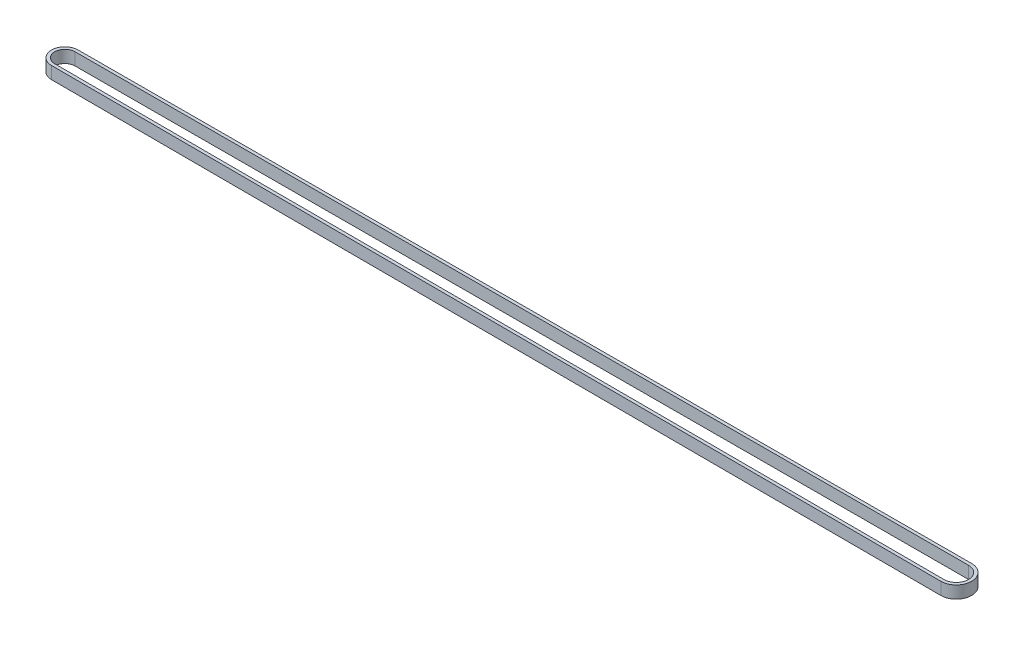
ISO-10303-21;
HEADER;
FILE_DESCRIPTION(('STEP AP214'),'2;1');
FILE_NAME('part.step','',(''),(''),'','','');
FILE_SCHEMA(('AUTOMOTIVE_DESIGN { 1 0 10303 214 1 1 1 1 }'));
ENDSEC;
DATA;
#1=APPLICATION_CONTEXT('core data for automotive mechanical design processes');
#2=APPLICATION_PROTOCOL_DEFINITION('international standard','automotive_design',2000,#1);
#3=PRODUCT_CONTEXT('',#1,'mechanical');
#4=PRODUCT('Part','Part','',(#3));
#5=PRODUCT_RELATED_PRODUCT_CATEGORY('part','',(#4));
#6=PRODUCT_DEFINITION_FORMATION('','',#4);
#7=PRODUCT_DEFINITION_CONTEXT('part definition',#1,'design');
#8=PRODUCT_DEFINITION('design','',#6,#7);
#9=PRODUCT_DEFINITION_SHAPE('','',#8);
#10=(LENGTH_UNIT() NAMED_UNIT(*) SI_UNIT(.MILLI.,.METRE.));
#11=(NAMED_UNIT(*) PLANE_ANGLE_UNIT() SI_UNIT($,.RADIAN.));
#12=(NAMED_UNIT(*) SI_UNIT($,.STERADIAN.) SOLID_ANGLE_UNIT());
#13=UNCERTAINTY_MEASURE_WITH_UNIT(LENGTH_MEASURE(1.E-05),#10,'distance_accuracy_value','');
#14=(GEOMETRIC_REPRESENTATION_CONTEXT(3) GLOBAL_UNCERTAINTY_ASSIGNED_CONTEXT((#13)) GLOBAL_UNIT_ASSIGNED_CONTEXT((#10,
#11,#12)) REPRESENTATION_CONTEXT('',''));
#15=CARTESIAN_POINT('',(0.,0.,0.));
#16=DIRECTION('',(0.,0.,1.));
#17=DIRECTION('',(1.,0.,0.));
#18=AXIS2_PLACEMENT_3D('',#15,#16,#17);
#19=CARTESIAN_POINT('',(-60.13,6.,0.));
#20=DIRECTION('',(0.,-1.,0.));
#21=DIRECTION('',(0.,0.,-1.));
#22=AXIS2_PLACEMENT_3D('',#19,#20,#21);
#23=PLANE('',#22);
#24=CARTESIAN_POINT('',(-60.13,6.,0.));
#25=DIRECTION('',(0.,1.,0.));
#26=DIRECTION('',(0.,0.,-1.));
#27=AXIS2_PLACEMENT_3D('',#24,#25,#26);
#28=CIRCLE('',#27,6.5);
#29=CARTESIAN_POINT('',(-60.1449873184229,6.,-6.49998272153753));
#30=VERTEX_POINT('',#29);
#31=CARTESIAN_POINT('',(-60.1449873184229,6.,6.49998272153754));
#32=VERTEX_POINT('',#31);
#33=EDGE_CURVE('E133',#30,#32,#28,.T.);
#34=ORIENTED_EDGE('',*,*,#33,.T.);
#35=DIRECTION('',(0.999997341775005,0.,0.00230574129582661));
#36=VECTOR('',#35,1.);
#37=CARTESIAN_POINT('',(-60.1449873184229,6.,6.49998272153754));
#38=LINE('',#37,#36);
#39=CARTESIAN_POINT('',(373.552706940281,6.,7.49998006331255));
#40=VERTEX_POINT('',#39);
#41=EDGE_CURVE('E136',#32,#40,#38,.T.);
#42=ORIENTED_EDGE('',*,*,#41,.T.);
#43=CARTESIAN_POINT('',(373.57,6.,0.));
#44=DIRECTION('',(0.,1.,0.));
#45=DIRECTION('',(0.,0.,-1.));
#46=AXIS2_PLACEMENT_3D('',#43,#44,#45);
#47=CIRCLE('',#46,7.5);
#48=CARTESIAN_POINT('',(373.552706940281,6.,-7.49998006331253));
#49=VERTEX_POINT('',#48);
#50=EDGE_CURVE('E139',#40,#49,#47,.T.);
#51=ORIENTED_EDGE('',*,*,#50,.T.);
#52=DIRECTION('',(-0.999997341775005,0.,0.00230574129582661));
#53=VECTOR('',#52,1.);
#54=CARTESIAN_POINT('',(-60.1449873184229,6.,-6.49998272153753));
#55=LINE('',#54,#53);
#56=EDGE_CURVE('E141',#49,#30,#55,.T.);
#57=ORIENTED_EDGE('',*,*,#56,.T.);
#58=EDGE_LOOP('',(#34,#42,#51,#57));
#59=FACE_BOUND('',#58,.T.);
#60=CARTESIAN_POINT('',(-60.13,6.,0.));
#61=DIRECTION('',(0.,1.,0.));
#62=DIRECTION('',(0.,0.,-1.));
#63=AXIS2_PLACEMENT_3D('',#60,#61,#62);
#64=CIRCLE('',#63,5.);
#65=CARTESIAN_POINT('',(-60.1415287064791,6.,-4.99998670887502));
#66=VERTEX_POINT('',#65);
#67=CARTESIAN_POINT('',(-60.1415287064791,6.,4.99998670887503));
#68=VERTEX_POINT('',#67);
#69=EDGE_CURVE('E97',#66,#68,#64,.T.);
#70=ORIENTED_EDGE('',*,*,#69,.F.);
#71=DIRECTION('',(-0.999997341775005,0.,0.00230574129582661));
#72=VECTOR('',#71,1.);
#73=CARTESIAN_POINT('',(-60.1415287064791,6.,-4.99998670887502));
#74=LINE('',#73,#72);
#75=CARTESIAN_POINT('',(373.556165552225,6.,-5.99998405065003));
#76=VERTEX_POINT('',#75);
#77=EDGE_CURVE('E119',#76,#66,#74,.T.);
#78=ORIENTED_EDGE('',*,*,#77,.F.);
#79=CARTESIAN_POINT('',(373.57,6.,0.));
#80=DIRECTION('',(0.,1.,0.));
#81=DIRECTION('',(0.,0.,-1.));
#82=AXIS2_PLACEMENT_3D('',#79,#80,#81);
#83=CIRCLE('',#82,6.);
#84=CARTESIAN_POINT('',(373.556165552225,6.,5.99998405065004));
#85=VERTEX_POINT('',#84);
#86=EDGE_CURVE('E117',#85,#76,#83,.T.);
#87=ORIENTED_EDGE('',*,*,#86,.F.);
#88=DIRECTION('',(0.999997341775005,0.,0.00230574129582661));
#89=VECTOR('',#88,1.);
#90=CARTESIAN_POINT('',(-60.1415287064791,6.,4.99998670887503));
#91=LINE('',#90,#89);
#92=EDGE_CURVE('E105',#68,#85,#91,.T.);
#93=ORIENTED_EDGE('',*,*,#92,.F.);
#94=EDGE_LOOP('',(#70,#78,#87,#93));
#95=FACE_BOUND('',#94,.T.);
#96=ADVANCED_FACE('F32',(#59,#95),#23,.F.);
#97=CARTESIAN_POINT('',(-60.13,0.,0.));
#98=DIRECTION('',(0.,-1.,0.));
#99=DIRECTION('',(0.,0.,-1.));
#100=AXIS2_PLACEMENT_3D('',#97,#98,#99);
#101=PLANE('',#100);
#102=CARTESIAN_POINT('',(-60.13,0.,0.));
#103=DIRECTION('',(0.,1.,0.));
#104=DIRECTION('',(0.,0.,-1.));
#105=AXIS2_PLACEMENT_3D('',#102,#103,#104);
#106=CIRCLE('',#105,6.5);
#107=CARTESIAN_POINT('',(-60.1449873184229,0.,-6.49998272153753));
#108=VERTEX_POINT('',#107);
#109=CARTESIAN_POINT('',(-60.1449873184229,0.,6.49998272153754));
#110=VERTEX_POINT('',#109);
#111=EDGE_CURVE('E113',#108,#110,#106,.T.);
#112=ORIENTED_EDGE('',*,*,#111,.F.);
#113=DIRECTION('',(-0.999997341775005,0.,0.00230574129582661));
#114=VECTOR('',#113,1.);
#115=CARTESIAN_POINT('',(-60.1449873184229,0.,-6.49998272153753));
#116=LINE('',#115,#114);
#117=CARTESIAN_POINT('',(373.552706940281,0.,-7.49998006331253));
#118=VERTEX_POINT('',#117);
#119=EDGE_CURVE('E137',#118,#108,#116,.T.);
#120=ORIENTED_EDGE('',*,*,#119,.F.);
#121=CARTESIAN_POINT('',(373.57,0.,0.));
#122=DIRECTION('',(0.,1.,0.));
#123=DIRECTION('',(0.,0.,-1.));
#124=AXIS2_PLACEMENT_3D('',#121,#122,#123);
#125=CIRCLE('',#124,7.5);
#126=CARTESIAN_POINT('',(373.552706940281,0.,7.49998006331255));
#127=VERTEX_POINT('',#126);
#128=EDGE_CURVE('E148',#127,#118,#125,.T.);
#129=ORIENTED_EDGE('',*,*,#128,.F.);
#130=DIRECTION('',(0.999997341775005,0.,0.00230574129582661));
#131=VECTOR('',#130,1.);
#132=CARTESIAN_POINT('',(-60.1449873184229,0.,6.49998272153754));
#133=LINE('',#132,#131);
#134=EDGE_CURVE('E146',#110,#127,#133,.T.);
#135=ORIENTED_EDGE('',*,*,#134,.F.);
#136=EDGE_LOOP('',(#112,#120,#129,#135));
#137=FACE_BOUND('',#136,.T.);
#138=DIRECTION('',(-0.999997341775005,0.,0.00230574129582661));
#139=VECTOR('',#138,1.);
#140=CARTESIAN_POINT('',(-60.1415287064791,0.,-4.99998670887502));
#141=LINE('',#140,#139);
#142=CARTESIAN_POINT('',(373.556165552225,0.,-5.99998405065003));
#143=VERTEX_POINT('',#142);
#144=CARTESIAN_POINT('',(-60.1415287064791,0.,-4.99998670887502));
#145=VERTEX_POINT('',#144);
#146=EDGE_CURVE('E106',#143,#145,#141,.T.);
#147=ORIENTED_EDGE('',*,*,#146,.T.);
#148=CARTESIAN_POINT('',(-60.13,0.,0.));
#149=DIRECTION('',(0.,1.,0.));
#150=DIRECTION('',(0.,0.,-1.));
#151=AXIS2_PLACEMENT_3D('',#148,#149,#150);
#152=CIRCLE('',#151,5.);
#153=CARTESIAN_POINT('',(-60.1415287064791,0.,4.99998670887503));
#154=VERTEX_POINT('',#153);
#155=EDGE_CURVE('E55',#145,#154,#152,.T.);
#156=ORIENTED_EDGE('',*,*,#155,.T.);
#157=DIRECTION('',(0.999997341775005,0.,0.00230574129582661));
#158=VECTOR('',#157,1.);
#159=CARTESIAN_POINT('',(-60.1415287064791,0.,4.99998670887503));
#160=LINE('',#159,#158);
#161=CARTESIAN_POINT('',(373.556165552225,0.,5.99998405065004));
#162=VERTEX_POINT('',#161);
#163=EDGE_CURVE('E112',#154,#162,#160,.T.);
#164=ORIENTED_EDGE('',*,*,#163,.T.);
#165=CARTESIAN_POINT('',(373.57,0.,0.));
#166=DIRECTION('',(0.,1.,0.));
#167=DIRECTION('',(0.,0.,-1.));
#168=AXIS2_PLACEMENT_3D('',#165,#166,#167);
#169=CIRCLE('',#168,6.);
#170=EDGE_CURVE('E125',#162,#143,#169,.T.);
#171=ORIENTED_EDGE('',*,*,#170,.T.);
#172=EDGE_LOOP('',(#147,#156,#164,#171));
#173=FACE_BOUND('',#172,.T.);
#174=ADVANCED_FACE('F166',(#137,#173),#101,.T.);
#175=CARTESIAN_POINT('',(-60.13,6.,0.));
#176=DIRECTION('',(0.,-1.,0.));
#177=DIRECTION('',(0.,0.,-1.));
#178=AXIS2_PLACEMENT_3D('',#175,#176,#177);
#179=CYLINDRICAL_SURFACE('',#178,6.5);
#180=ORIENTED_EDGE('',*,*,#111,.T.);
#181=DIRECTION('',(0.,-1.,0.));
#182=VECTOR('',#181,1.);
#183=CARTESIAN_POINT('',(-60.1449873184229,6.,6.49998272153754));
#184=LINE('',#183,#182);
#185=EDGE_CURVE('E11',#32,#110,#184,.T.);
#186=ORIENTED_EDGE('',*,*,#185,.F.);
#187=ORIENTED_EDGE('',*,*,#33,.F.);
#188=DIRECTION('',(0.,-1.,0.));
#189=VECTOR('',#188,1.);
#190=CARTESIAN_POINT('',(-60.1449873184229,6.,-6.49998272153753));
#191=LINE('',#190,#189);
#192=EDGE_CURVE('E143',#30,#108,#191,.T.);
#193=ORIENTED_EDGE('',*,*,#192,.T.);
#194=EDGE_LOOP('',(#180,#186,#187,#193));
#195=FACE_BOUND('',#194,.T.);
#196=ADVANCED_FACE('F34',(#195),#179,.T.);
#197=CARTESIAN_POINT('',(-60.1449873184229,6.,6.49998272153754));
#198=DIRECTION('',(0.00230574129582661,0.,-0.999997341775005));
#199=DIRECTION('',(-0.999997341775005,0.,-0.00230574129582661));
#200=AXIS2_PLACEMENT_3D('',#197,#198,#199);
#201=PLANE('',#200);
#202=ORIENTED_EDGE('',*,*,#134,.T.);
#203=DIRECTION('',(0.,-1.,0.));
#204=VECTOR('',#203,1.);
#205=CARTESIAN_POINT('',(373.552706940281,6.,7.49998006331255));
#206=LINE('',#205,#204);
#207=EDGE_CURVE('E40',#40,#127,#206,.T.);
#208=ORIENTED_EDGE('',*,*,#207,.F.);
#209=ORIENTED_EDGE('',*,*,#41,.F.);
#210=ORIENTED_EDGE('',*,*,#185,.T.);
#211=EDGE_LOOP('',(#202,#208,#209,#210));
#212=FACE_BOUND('',#211,.T.);
#213=ADVANCED_FACE('F176',(#212),#201,.F.);
#214=CARTESIAN_POINT('',(373.57,6.,0.));
#215=DIRECTION('',(0.,-1.,0.));
#216=DIRECTION('',(0.,0.,-1.));
#217=AXIS2_PLACEMENT_3D('',#214,#215,#216);
#218=CYLINDRICAL_SURFACE('',#217,7.5);
#219=ORIENTED_EDGE('',*,*,#128,.T.);
#220=DIRECTION('',(0.,-1.,0.));
#221=VECTOR('',#220,1.);
#222=CARTESIAN_POINT('',(373.552706940281,6.,-7.49998006331253));
#223=LINE('',#222,#221);
#224=EDGE_CURVE('E153',#49,#118,#223,.T.);
#225=ORIENTED_EDGE('',*,*,#224,.F.);
#226=ORIENTED_EDGE('',*,*,#50,.F.);
#227=ORIENTED_EDGE('',*,*,#207,.T.);
#228=EDGE_LOOP('',(#219,#225,#226,#227));
#229=FACE_BOUND('',#228,.T.);
#230=ADVANCED_FACE('F160',(#229),#218,.T.);
#231=CARTESIAN_POINT('',(-60.1449873184229,6.,-6.49998272153753));
#232=DIRECTION('',(0.00230574129582661,0.,0.999997341775005));
#233=DIRECTION('',(0.999997341775005,0.,-0.00230574129582661));
#234=AXIS2_PLACEMENT_3D('',#231,#232,#233);
#235=PLANE('',#234);
#236=ORIENTED_EDGE('',*,*,#119,.T.);
#237=ORIENTED_EDGE('',*,*,#192,.F.);
#238=ORIENTED_EDGE('',*,*,#56,.F.);
#239=ORIENTED_EDGE('',*,*,#224,.T.);
#240=EDGE_LOOP('',(#236,#237,#238,#239));
#241=FACE_BOUND('',#240,.T.);
#242=ADVANCED_FACE('F170',(#241),#235,.F.);
#243=CARTESIAN_POINT('',(-60.13,6.,0.));
#244=DIRECTION('',(0.,-1.,0.));
#245=DIRECTION('',(0.,0.,-1.));
#246=AXIS2_PLACEMENT_3D('',#243,#244,#245);
#247=CYLINDRICAL_SURFACE('',#246,5.);
#248=ORIENTED_EDGE('',*,*,#155,.F.);
#249=DIRECTION('',(0.,-1.,0.));
#250=VECTOR('',#249,1.);
#251=CARTESIAN_POINT('',(-60.1415287064791,6.,-4.99998670887502));
#252=LINE('',#251,#250);
#253=EDGE_CURVE('E101',#66,#145,#252,.T.);
#254=ORIENTED_EDGE('',*,*,#253,.F.);
#255=ORIENTED_EDGE('',*,*,#69,.T.);
#256=DIRECTION('',(0.,-1.,0.));
#257=VECTOR('',#256,1.);
#258=CARTESIAN_POINT('',(-60.1415287064791,6.,4.99998670887503));
#259=LINE('',#258,#257);
#260=EDGE_CURVE('E100',#68,#154,#259,.T.);
#261=ORIENTED_EDGE('',*,*,#260,.T.);
#262=EDGE_LOOP('',(#248,#254,#255,#261));
#263=FACE_BOUND('',#262,.T.);
#264=ADVANCED_FACE('F99',(#263),#247,.F.);
#265=CARTESIAN_POINT('',(-60.1415287064791,6.,4.99998670887503));
#266=DIRECTION('',(0.00230574129582661,0.,-0.999997341775005));
#267=DIRECTION('',(-0.999997341775005,0.,-0.00230574129582661));
#268=AXIS2_PLACEMENT_3D('',#265,#266,#267);
#269=PLANE('',#268);
#270=ORIENTED_EDGE('',*,*,#163,.F.);
#271=ORIENTED_EDGE('',*,*,#260,.F.);
#272=ORIENTED_EDGE('',*,*,#92,.T.);
#273=DIRECTION('',(0.,-1.,0.));
#274=VECTOR('',#273,1.);
#275=CARTESIAN_POINT('',(373.556165552225,6.,5.99998405065004));
#276=LINE('',#275,#274);
#277=EDGE_CURVE('E114',#85,#162,#276,.T.);
#278=ORIENTED_EDGE('',*,*,#277,.T.);
#279=EDGE_LOOP('',(#270,#271,#272,#278));
#280=FACE_BOUND('',#279,.T.);
#281=ADVANCED_FACE('F109',(#280),#269,.T.);
#282=CARTESIAN_POINT('',(373.57,6.,0.));
#283=DIRECTION('',(0.,-1.,0.));
#284=DIRECTION('',(0.,0.,-1.));
#285=AXIS2_PLACEMENT_3D('',#282,#283,#284);
#286=CYLINDRICAL_SURFACE('',#285,6.);
#287=ORIENTED_EDGE('',*,*,#170,.F.);
#288=ORIENTED_EDGE('',*,*,#277,.F.);
#289=ORIENTED_EDGE('',*,*,#86,.T.);
#290=DIRECTION('',(0.,-1.,0.));
#291=VECTOR('',#290,1.);
#292=CARTESIAN_POINT('',(373.556165552225,6.,-5.99998405065003));
#293=LINE('',#292,#291);
#294=EDGE_CURVE('E47',#76,#143,#293,.T.);
#295=ORIENTED_EDGE('',*,*,#294,.T.);
#296=EDGE_LOOP('',(#287,#288,#289,#295));
#297=FACE_BOUND('',#296,.T.);
#298=ADVANCED_FACE('F199',(#297),#286,.F.);
#299=CARTESIAN_POINT('',(-60.1415287064791,6.,-4.99998670887502));
#300=DIRECTION('',(0.00230574129582661,0.,0.999997341775005));
#301=DIRECTION('',(0.999997341775005,0.,-0.00230574129582661));
#302=AXIS2_PLACEMENT_3D('',#299,#300,#301);
#303=PLANE('',#302);
#304=ORIENTED_EDGE('',*,*,#146,.F.);
#305=ORIENTED_EDGE('',*,*,#294,.F.);
#306=ORIENTED_EDGE('',*,*,#77,.T.);
#307=ORIENTED_EDGE('',*,*,#253,.T.);
#308=EDGE_LOOP('',(#304,#305,#306,#307));
#309=FACE_BOUND('',#308,.T.);
#310=ADVANCED_FACE('F203',(#309),#303,.T.);
#311=CLOSED_SHELL('',(#96,#174,#196,#213,#230,#242,#264,#281,#298,#310));
#312=MANIFOLD_SOLID_BREP('B2',#311);
#313=ADVANCED_BREP_SHAPE_REPRESENTATION('',(#18,#312),#14);
#314=SHAPE_DEFINITION_REPRESENTATION(#9,#313);
ENDSEC;
END-ISO-10303-21;
